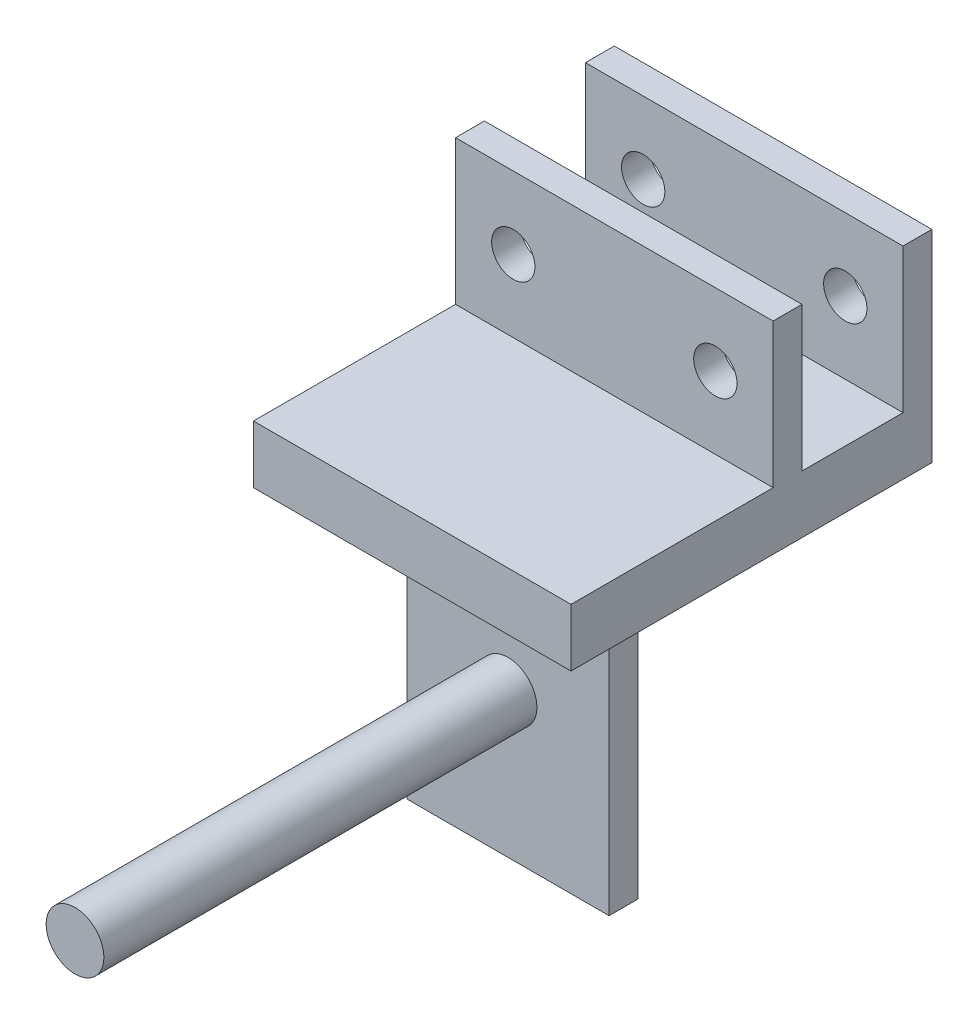
ISO-10303-21;
HEADER;
FILE_DESCRIPTION(('STEP AP214'),'2;1');
FILE_NAME('part.step','',(''),(''),'','','');
FILE_SCHEMA(('AUTOMOTIVE_DESIGN { 1 0 10303 214 1 1 1 1 }'));
ENDSEC;
DATA;
#1=APPLICATION_CONTEXT('core data for automotive mechanical design processes');
#2=APPLICATION_PROTOCOL_DEFINITION('international standard','automotive_design',2000,#1);
#3=PRODUCT_CONTEXT('',#1,'mechanical');
#4=PRODUCT('Part','Part','',(#3));
#5=PRODUCT_RELATED_PRODUCT_CATEGORY('part','',(#4));
#6=PRODUCT_DEFINITION_FORMATION('','',#4);
#7=PRODUCT_DEFINITION_CONTEXT('part definition',#1,'design');
#8=PRODUCT_DEFINITION('design','',#6,#7);
#9=PRODUCT_DEFINITION_SHAPE('','',#8);
#10=(LENGTH_UNIT() NAMED_UNIT(*) SI_UNIT(.MILLI.,.METRE.));
#11=(NAMED_UNIT(*) PLANE_ANGLE_UNIT() SI_UNIT($,.RADIAN.));
#12=(NAMED_UNIT(*) SI_UNIT($,.STERADIAN.) SOLID_ANGLE_UNIT());
#13=UNCERTAINTY_MEASURE_WITH_UNIT(LENGTH_MEASURE(1.E-05),#10,'distance_accuracy_value','');
#14=(GEOMETRIC_REPRESENTATION_CONTEXT(3) GLOBAL_UNCERTAINTY_ASSIGNED_CONTEXT((#13)) GLOBAL_UNIT_ASSIGNED_CONTEXT((#10,
#11,#12)) REPRESENTATION_CONTEXT('',''));
#15=CARTESIAN_POINT('',(0.,0.,0.));
#16=DIRECTION('',(0.,0.,1.));
#17=DIRECTION('',(1.,0.,0.));
#18=AXIS2_PLACEMENT_3D('',#15,#16,#17);
#19=CARTESIAN_POINT('',(0.,0.,0.));
#20=DIRECTION('',(0.,1.,0.));
#21=DIRECTION('',(0.,0.,1.));
#22=AXIS2_PLACEMENT_3D('',#19,#20,#21);
#23=PLANE('',#22);
#24=DIRECTION('',(0.,0.,1.));
#25=VECTOR('',#24,1.);
#26=CARTESIAN_POINT('',(-45.831985696917,0.,5.44161698032525));
#27=LINE('',#26,#25);
#28=CARTESIAN_POINT('',(-45.831985696917,0.,5.44161698032525));
#29=VERTEX_POINT('',#28);
#30=CARTESIAN_POINT('',(-45.831985696917,0.,30.4416169803253));
#31=VERTEX_POINT('',#30);
#32=EDGE_CURVE('E230',#29,#31,#27,.T.);
#33=ORIENTED_EDGE('',*,*,#32,.F.);
#34=DIRECTION('',(-1.,0.,0.));
#35=VECTOR('',#34,1.);
#36=CARTESIAN_POINT('',(-45.831985696917,0.,5.44161698032525));
#37=LINE('',#36,#35);
#38=CARTESIAN_POINT('',(-23.831985696917,0.,5.44161698032525));
#39=VERTEX_POINT('',#38);
#40=EDGE_CURVE('E246',#39,#29,#37,.T.);
#41=ORIENTED_EDGE('',*,*,#40,.F.);
#42=DIRECTION('',(0.,0.,-1.));
#43=VECTOR('',#42,1.);
#44=CARTESIAN_POINT('',(-23.831985696917,0.,5.44161698032525));
#45=LINE('',#44,#43);
#46=CARTESIAN_POINT('',(-23.831985696917,0.,30.4416169803253));
#47=VERTEX_POINT('',#46);
#48=EDGE_CURVE('E244',#47,#39,#45,.T.);
#49=ORIENTED_EDGE('',*,*,#48,.F.);
#50=DIRECTION('',(1.,0.,0.));
#51=VECTOR('',#50,1.);
#52=CARTESIAN_POINT('',(-45.831985696917,0.,30.4416169803253));
#53=LINE('',#52,#51);
#54=EDGE_CURVE('E242',#31,#47,#53,.T.);
#55=ORIENTED_EDGE('',*,*,#54,.F.);
#56=EDGE_LOOP('',(#33,#41,#49,#55));
#57=FACE_BOUND('',#56,.T.);
#58=DIRECTION('',(0.,0.,-1.));
#59=VECTOR('',#58,1.);
#60=CARTESIAN_POINT('',(-41.831985696917,0.,23.8053337188196));
#61=LINE('',#60,#59);
#62=CARTESIAN_POINT('',(-41.831985696917,0.,23.8053337188196));
#63=VERTEX_POINT('',#62);
#64=CARTESIAN_POINT('',(-41.831985696917,0.,21.8053337188196));
#65=VERTEX_POINT('',#64);
#66=EDGE_CURVE('E157',#63,#65,#61,.T.);
#67=ORIENTED_EDGE('',*,*,#66,.F.);
#68=DIRECTION('',(-1.,0.,0.));
#69=VECTOR('',#68,1.);
#70=CARTESIAN_POINT('',(-41.831985696917,0.,23.8053337188196));
#71=LINE('',#70,#69);
#72=CARTESIAN_POINT('',(-27.831985696917,0.,23.8053337188196));
#73=VERTEX_POINT('',#72);
#74=EDGE_CURVE('E154',#73,#63,#71,.T.);
#75=ORIENTED_EDGE('',*,*,#74,.F.);
#76=DIRECTION('',(0.,0.,1.));
#77=VECTOR('',#76,1.);
#78=CARTESIAN_POINT('',(-27.831985696917,0.,23.8053337188196));
#79=LINE('',#78,#77);
#80=CARTESIAN_POINT('',(-27.831985696917,0.,21.8053337188196));
#81=VERTEX_POINT('',#80);
#82=EDGE_CURVE('E56',#81,#73,#79,.T.);
#83=ORIENTED_EDGE('',*,*,#82,.F.);
#84=DIRECTION('',(1.,0.,0.));
#85=VECTOR('',#84,1.);
#86=CARTESIAN_POINT('',(-41.831985696917,0.,21.8053337188196));
#87=LINE('',#86,#85);
#88=EDGE_CURVE('E51',#65,#81,#87,.T.);
#89=ORIENTED_EDGE('',*,*,#88,.F.);
#90=EDGE_LOOP('',(#67,#75,#83,#89));
#91=FACE_BOUND('',#90,.T.);
#92=ADVANCED_FACE('F36',(#57,#91),#23,.F.);
#93=CARTESIAN_POINT('',(0.,4.,0.));
#94=DIRECTION('',(0.,1.,0.));
#95=DIRECTION('',(0.,0.,1.));
#96=AXIS2_PLACEMENT_3D('',#93,#94,#95);
#97=PLANE('',#96);
#98=DIRECTION('',(0.,0.,-1.));
#99=VECTOR('',#98,1.);
#100=CARTESIAN_POINT('',(-23.831985696917,4.,5.44161698032525));
#101=LINE('',#100,#99);
#102=CARTESIAN_POINT('',(-23.831985696917,4.,30.4416169803253));
#103=VERTEX_POINT('',#102);
#104=CARTESIAN_POINT('',(-23.831985696917,4.,16.4416169803253));
#105=VERTEX_POINT('',#104);
#106=EDGE_CURVE('E237',#103,#105,#101,.T.);
#107=ORIENTED_EDGE('',*,*,#106,.T.);
#108=DIRECTION('',(1.,0.,0.));
#109=VECTOR('',#108,1.);
#110=CARTESIAN_POINT('',(0.,4.,16.4416169803253));
#111=LINE('',#110,#109);
#112=CARTESIAN_POINT('',(-45.831985696917,4.,16.4416169803253));
#113=VERTEX_POINT('',#112);
#114=EDGE_CURVE('E183',#113,#105,#111,.T.);
#115=ORIENTED_EDGE('',*,*,#114,.F.);
#116=DIRECTION('',(0.,0.,1.));
#117=VECTOR('',#116,1.);
#118=CARTESIAN_POINT('',(-45.831985696917,4.,5.44161698032525));
#119=LINE('',#118,#117);
#120=CARTESIAN_POINT('',(-45.831985696917,4.,30.4416169803253));
#121=VERTEX_POINT('',#120);
#122=EDGE_CURVE('E234',#113,#121,#119,.T.);
#123=ORIENTED_EDGE('',*,*,#122,.T.);
#124=DIRECTION('',(1.,0.,0.));
#125=VECTOR('',#124,1.);
#126=CARTESIAN_POINT('',(-45.831985696917,4.,30.4416169803253));
#127=LINE('',#126,#125);
#128=EDGE_CURVE('E233',#121,#103,#127,.T.);
#129=ORIENTED_EDGE('',*,*,#128,.T.);
#130=EDGE_LOOP('',(#107,#115,#123,#129));
#131=FACE_BOUND('',#130,.T.);
#132=ADVANCED_FACE('F298',(#131),#97,.T.);
#133=CARTESIAN_POINT('',(-45.831985696917,4.,5.44161698032525));
#134=DIRECTION('',(1.,0.,0.));
#135=DIRECTION('',(0.,0.,-1.));
#136=AXIS2_PLACEMENT_3D('',#133,#134,#135);
#137=PLANE('',#136);
#138=ORIENTED_EDGE('',*,*,#32,.T.);
#139=DIRECTION('',(0.,-1.,0.));
#140=VECTOR('',#139,1.);
#141=CARTESIAN_POINT('',(-45.831985696917,4.,30.4416169803253));
#142=LINE('',#141,#140);
#143=EDGE_CURVE('E44',#121,#31,#142,.T.);
#144=ORIENTED_EDGE('',*,*,#143,.F.);
#145=ORIENTED_EDGE('',*,*,#122,.F.);
#146=DIRECTION('',(0.,-1.,0.));
#147=VECTOR('',#146,1.);
#148=CARTESIAN_POINT('',(-45.831985696917,14.,16.4416169803253));
#149=LINE('',#148,#147);
#150=CARTESIAN_POINT('',(-45.831985696917,14.,16.4416169803253));
#151=VERTEX_POINT('',#150);
#152=EDGE_CURVE('E207',#151,#113,#149,.T.);
#153=ORIENTED_EDGE('',*,*,#152,.F.);
#154=DIRECTION('',(0.,0.,1.));
#155=VECTOR('',#154,1.);
#156=CARTESIAN_POINT('',(-45.831985696917,14.,0.));
#157=LINE('',#156,#155);
#158=CARTESIAN_POINT('',(-45.831985696917,14.,14.4416169803253));
#159=VERTEX_POINT('',#158);
#160=EDGE_CURVE('E184',#159,#151,#157,.T.);
#161=ORIENTED_EDGE('',*,*,#160,.F.);
#162=DIRECTION('',(0.,-1.,0.));
#163=VECTOR('',#162,1.);
#164=CARTESIAN_POINT('',(-45.831985696917,14.,14.4416169803253));
#165=LINE('',#164,#163);
#166=CARTESIAN_POINT('',(-45.831985696917,4.,14.4416169803253));
#167=VERTEX_POINT('',#166);
#168=EDGE_CURVE('E195',#159,#167,#165,.T.);
#169=ORIENTED_EDGE('',*,*,#168,.T.);
#170=CARTESIAN_POINT('',(-45.831985696917,4.,7.44161698032525));
#171=VERTEX_POINT('',#170);
#172=EDGE_CURVE('E231',#171,#167,#119,.T.);
#173=ORIENTED_EDGE('',*,*,#172,.F.);
#174=DIRECTION('',(0.,-1.,0.));
#175=VECTOR('',#174,1.);
#176=CARTESIAN_POINT('',(-45.831985696917,14.,7.44161698032525));
#177=LINE('',#176,#175);
#178=CARTESIAN_POINT('',(-45.831985696917,14.,7.44161698032525));
#179=VERTEX_POINT('',#178);
#180=EDGE_CURVE('E227',#179,#171,#177,.T.);
#181=ORIENTED_EDGE('',*,*,#180,.F.);
#182=DIRECTION('',(0.,0.,1.));
#183=VECTOR('',#182,1.);
#184=CARTESIAN_POINT('',(-45.831985696917,14.,0.));
#185=LINE('',#184,#183);
#186=CARTESIAN_POINT('',(-45.831985696917,14.,5.44161698032525));
#187=VERTEX_POINT('',#186);
#188=EDGE_CURVE('E211',#187,#179,#185,.T.);
#189=ORIENTED_EDGE('',*,*,#188,.F.);
#190=DIRECTION('',(0.,-1.,0.));
#191=VECTOR('',#190,1.);
#192=CARTESIAN_POINT('',(-45.831985696917,4.,5.44161698032525));
#193=LINE('',#192,#191);
#194=EDGE_CURVE('E239',#187,#29,#193,.T.);
#195=ORIENTED_EDGE('',*,*,#194,.T.);
#196=EDGE_LOOP('',(#138,#144,#145,#153,#161,#169,#173,#181,#189,#195));
#197=FACE_BOUND('',#196,.T.);
#198=ADVANCED_FACE('F38',(#197),#137,.F.);
#199=CARTESIAN_POINT('',(-45.831985696917,4.,30.4416169803253));
#200=DIRECTION('',(0.,0.,-1.));
#201=DIRECTION('',(-1.,0.,0.));
#202=AXIS2_PLACEMENT_3D('',#199,#200,#201);
#203=PLANE('',#202);
#204=ORIENTED_EDGE('',*,*,#54,.T.);
#205=DIRECTION('',(0.,-1.,0.));
#206=VECTOR('',#205,1.);
#207=CARTESIAN_POINT('',(-23.831985696917,4.,30.4416169803253));
#208=LINE('',#207,#206);
#209=EDGE_CURVE('E253',#103,#47,#208,.T.);
#210=ORIENTED_EDGE('',*,*,#209,.F.);
#211=ORIENTED_EDGE('',*,*,#128,.F.);
#212=ORIENTED_EDGE('',*,*,#143,.T.);
#213=EDGE_LOOP('',(#204,#210,#211,#212));
#214=FACE_BOUND('',#213,.T.);
#215=ADVANCED_FACE('F303',(#214),#203,.F.);
#216=CARTESIAN_POINT('',(-23.831985696917,4.,5.44161698032525));
#217=DIRECTION('',(-1.,0.,0.));
#218=DIRECTION('',(0.,0.,1.));
#219=AXIS2_PLACEMENT_3D('',#216,#217,#218);
#220=PLANE('',#219);
#221=ORIENTED_EDGE('',*,*,#48,.T.);
#222=DIRECTION('',(0.,-1.,0.));
#223=VECTOR('',#222,1.);
#224=CARTESIAN_POINT('',(-23.831985696917,4.,5.44161698032525));
#225=LINE('',#224,#223);
#226=CARTESIAN_POINT('',(-23.831985696917,14.,5.44161698032525));
#227=VERTEX_POINT('',#226);
#228=EDGE_CURVE('E250',#227,#39,#225,.T.);
#229=ORIENTED_EDGE('',*,*,#228,.F.);
#230=DIRECTION('',(0.,0.,-1.));
#231=VECTOR('',#230,1.);
#232=CARTESIAN_POINT('',(-23.831985696917,14.,0.));
#233=LINE('',#232,#231);
#234=CARTESIAN_POINT('',(-23.831985696917,14.,7.44161698032525));
#235=VERTEX_POINT('',#234);
#236=EDGE_CURVE('E216',#235,#227,#233,.T.);
#237=ORIENTED_EDGE('',*,*,#236,.F.);
#238=DIRECTION('',(0.,-1.,0.));
#239=VECTOR('',#238,1.);
#240=CARTESIAN_POINT('',(-23.831985696917,14.,7.44161698032525));
#241=LINE('',#240,#239);
#242=CARTESIAN_POINT('',(-23.831985696917,4.,7.44161698032525));
#243=VERTEX_POINT('',#242);
#244=EDGE_CURVE('E222',#235,#243,#241,.T.);
#245=ORIENTED_EDGE('',*,*,#244,.T.);
#246=CARTESIAN_POINT('',(-23.831985696917,4.,14.4416169803253));
#247=VERTEX_POINT('',#246);
#248=EDGE_CURVE('E236',#247,#243,#101,.T.);
#249=ORIENTED_EDGE('',*,*,#248,.F.);
#250=DIRECTION('',(0.,-1.,0.));
#251=VECTOR('',#250,1.);
#252=CARTESIAN_POINT('',(-23.831985696917,14.,14.4416169803253));
#253=LINE('',#252,#251);
#254=CARTESIAN_POINT('',(-23.831985696917,14.,14.4416169803253));
#255=VERTEX_POINT('',#254);
#256=EDGE_CURVE('E201',#255,#247,#253,.T.);
#257=ORIENTED_EDGE('',*,*,#256,.F.);
#258=DIRECTION('',(0.,0.,-1.));
#259=VECTOR('',#258,1.);
#260=CARTESIAN_POINT('',(-23.831985696917,14.,0.));
#261=LINE('',#260,#259);
#262=CARTESIAN_POINT('',(-23.831985696917,14.,16.4416169803253));
#263=VERTEX_POINT('',#262);
#264=EDGE_CURVE('E190',#263,#255,#261,.T.);
#265=ORIENTED_EDGE('',*,*,#264,.F.);
#266=DIRECTION('',(0.,-1.,0.));
#267=VECTOR('',#266,1.);
#268=CARTESIAN_POINT('',(-23.831985696917,14.,16.4416169803253));
#269=LINE('',#268,#267);
#270=EDGE_CURVE('E204',#263,#105,#269,.T.);
#271=ORIENTED_EDGE('',*,*,#270,.T.);
#272=ORIENTED_EDGE('',*,*,#106,.F.);
#273=ORIENTED_EDGE('',*,*,#209,.T.);
#274=EDGE_LOOP('',(#221,#229,#237,#245,#249,#257,#265,#271,#272,#273));
#275=FACE_BOUND('',#274,.T.);
#276=ADVANCED_FACE('F281',(#275),#220,.F.);
#277=CARTESIAN_POINT('',(-45.831985696917,4.,5.44161698032525));
#278=DIRECTION('',(0.,0.,1.));
#279=DIRECTION('',(1.,0.,0.));
#280=AXIS2_PLACEMENT_3D('',#277,#278,#279);
#281=PLANE('',#280);
#282=CARTESIAN_POINT('',(-27.831985696917,9.,5.44161698032526));
#283=DIRECTION('',(0.,0.,1.));
#284=DIRECTION('',(1.,0.,0.));
#285=AXIS2_PLACEMENT_3D('',#282,#283,#284);
#286=CIRCLE('',#285,1.5);
#287=CARTESIAN_POINT('',(-26.331985696917,9.,5.44161698032526));
#288=VERTEX_POINT('',#287);
#289=EDGE_CURVE('E161',#288,#288,#286,.T.);
#290=ORIENTED_EDGE('',*,*,#289,.T.);
#291=EDGE_LOOP('',(#290));
#292=FACE_BOUND('',#291,.T.);
#293=CARTESIAN_POINT('',(-41.831985696917,9.,5.44161698032526));
#294=DIRECTION('',(0.,0.,1.));
#295=DIRECTION('',(1.,0.,0.));
#296=AXIS2_PLACEMENT_3D('',#293,#294,#295);
#297=CIRCLE('',#296,1.5);
#298=CARTESIAN_POINT('',(-40.331985696917,9.,5.44161698032526));
#299=VERTEX_POINT('',#298);
#300=EDGE_CURVE('E174',#299,#299,#297,.T.);
#301=ORIENTED_EDGE('',*,*,#300,.T.);
#302=EDGE_LOOP('',(#301));
#303=FACE_BOUND('',#302,.T.);
#304=ORIENTED_EDGE('',*,*,#40,.T.);
#305=ORIENTED_EDGE('',*,*,#194,.F.);
#306=DIRECTION('',(-1.,0.,0.));
#307=VECTOR('',#306,1.);
#308=CARTESIAN_POINT('',(0.,14.,5.44161698032525));
#309=LINE('',#308,#307);
#310=EDGE_CURVE('E219',#227,#187,#309,.T.);
#311=ORIENTED_EDGE('',*,*,#310,.F.);
#312=ORIENTED_EDGE('',*,*,#228,.T.);
#313=EDGE_LOOP('',(#304,#305,#311,#312));
#314=FACE_BOUND('',#313,.T.);
#315=ADVANCED_FACE('F309',(#292,#303,#314),#281,.F.);
#316=DIRECTION('',(1.,0.,0.));
#317=VECTOR('',#316,1.);
#318=CARTESIAN_POINT('',(0.,4.,14.4416169803253));
#319=LINE('',#318,#317);
#320=EDGE_CURVE('E188',#167,#247,#319,.T.);
#321=ORIENTED_EDGE('',*,*,#320,.T.);
#322=ORIENTED_EDGE('',*,*,#248,.T.);
#323=DIRECTION('',(1.,0.,0.));
#324=VECTOR('',#323,1.);
#325=CARTESIAN_POINT('',(0.,4.,7.44161698032526));
#326=LINE('',#325,#324);
#327=EDGE_CURVE('E210',#171,#243,#326,.T.);
#328=ORIENTED_EDGE('',*,*,#327,.F.);
#329=ORIENTED_EDGE('',*,*,#172,.T.);
#330=EDGE_LOOP('',(#321,#322,#328,#329));
#331=FACE_BOUND('',#330,.T.);
#332=ADVANCED_FACE('F278',(#331),#97,.T.);
#333=CARTESIAN_POINT('',(0.,14.,7.44161698032526));
#334=DIRECTION('',(0.,0.,-1.));
#335=DIRECTION('',(-1.,0.,0.));
#336=AXIS2_PLACEMENT_3D('',#333,#334,#335);
#337=PLANE('',#336);
#338=CARTESIAN_POINT('',(-27.831985696917,9.,7.44161698032526));
#339=DIRECTION('',(0.,0.,-1.));
#340=DIRECTION('',(-1.,0.,0.));
#341=AXIS2_PLACEMENT_3D('',#338,#339,#340);
#342=CIRCLE('',#341,1.5);
#343=CARTESIAN_POINT('',(-29.331985696917,9.,7.44161698032526));
#344=VERTEX_POINT('',#343);
#345=EDGE_CURVE('E170',#344,#344,#342,.T.);
#346=ORIENTED_EDGE('',*,*,#345,.T.);
#347=EDGE_LOOP('',(#346));
#348=FACE_BOUND('',#347,.T.);
#349=CARTESIAN_POINT('',(-41.831985696917,9.,7.44161698032525));
#350=DIRECTION('',(0.,0.,-1.));
#351=DIRECTION('',(-1.,0.,0.));
#352=AXIS2_PLACEMENT_3D('',#349,#350,#351);
#353=CIRCLE('',#352,1.5);
#354=CARTESIAN_POINT('',(-43.331985696917,9.,7.44161698032525));
#355=VERTEX_POINT('',#354);
#356=EDGE_CURVE('E180',#355,#355,#353,.T.);
#357=ORIENTED_EDGE('',*,*,#356,.T.);
#358=EDGE_LOOP('',(#357));
#359=FACE_BOUND('',#358,.T.);
#360=ORIENTED_EDGE('',*,*,#327,.T.);
#361=ORIENTED_EDGE('',*,*,#244,.F.);
#362=DIRECTION('',(1.,0.,0.));
#363=VECTOR('',#362,1.);
#364=CARTESIAN_POINT('',(0.,14.,7.44161698032526));
#365=LINE('',#364,#363);
#366=EDGE_CURVE('E214',#179,#235,#365,.T.);
#367=ORIENTED_EDGE('',*,*,#366,.F.);
#368=ORIENTED_EDGE('',*,*,#180,.T.);
#369=EDGE_LOOP('',(#360,#361,#367,#368));
#370=FACE_BOUND('',#369,.T.);
#371=ADVANCED_FACE('F286',(#348,#359,#370),#337,.F.);
#372=CARTESIAN_POINT('',(0.,14.,0.));
#373=DIRECTION('',(0.,1.,0.));
#374=DIRECTION('',(0.,0.,1.));
#375=AXIS2_PLACEMENT_3D('',#372,#373,#374);
#376=PLANE('',#375);
#377=ORIENTED_EDGE('',*,*,#188,.T.);
#378=ORIENTED_EDGE('',*,*,#366,.T.);
#379=ORIENTED_EDGE('',*,*,#236,.T.);
#380=ORIENTED_EDGE('',*,*,#310,.T.);
#381=EDGE_LOOP('',(#377,#378,#379,#380));
#382=FACE_BOUND('',#381,.T.);
#383=ADVANCED_FACE('F312',(#382),#376,.T.);
#384=CARTESIAN_POINT('',(0.,14.,16.4416169803253));
#385=DIRECTION('',(0.,0.,-1.));
#386=DIRECTION('',(-1.,0.,0.));
#387=AXIS2_PLACEMENT_3D('',#384,#385,#386);
#388=PLANE('',#387);
#389=CARTESIAN_POINT('',(-27.831985696917,9.,16.4416169803253));
#390=DIRECTION('',(0.,0.,1.));
#391=DIRECTION('',(1.,0.,0.));
#392=AXIS2_PLACEMENT_3D('',#389,#390,#391);
#393=CIRCLE('',#392,1.5);
#394=CARTESIAN_POINT('',(-26.331985696917,9.,16.4416169803253));
#395=VERTEX_POINT('',#394);
#396=EDGE_CURVE('E158',#395,#395,#393,.T.);
#397=ORIENTED_EDGE('',*,*,#396,.F.);
#398=EDGE_LOOP('',(#397));
#399=FACE_BOUND('',#398,.T.);
#400=CARTESIAN_POINT('',(-41.831985696917,9.,16.4416169803253));
#401=DIRECTION('',(0.,0.,1.));
#402=DIRECTION('',(1.,0.,0.));
#403=AXIS2_PLACEMENT_3D('',#400,#401,#402);
#404=CIRCLE('',#403,1.5);
#405=CARTESIAN_POINT('',(-40.331985696917,9.,16.4416169803253));
#406=VERTEX_POINT('',#405);
#407=EDGE_CURVE('E173',#406,#406,#404,.T.);
#408=ORIENTED_EDGE('',*,*,#407,.F.);
#409=EDGE_LOOP('',(#408));
#410=FACE_BOUND('',#409,.T.);
#411=ORIENTED_EDGE('',*,*,#114,.T.);
#412=ORIENTED_EDGE('',*,*,#270,.F.);
#413=DIRECTION('',(1.,0.,0.));
#414=VECTOR('',#413,1.);
#415=CARTESIAN_POINT('',(0.,14.,16.4416169803253));
#416=LINE('',#415,#414);
#417=EDGE_CURVE('E187',#151,#263,#416,.T.);
#418=ORIENTED_EDGE('',*,*,#417,.F.);
#419=ORIENTED_EDGE('',*,*,#152,.T.);
#420=EDGE_LOOP('',(#411,#412,#418,#419));
#421=FACE_BOUND('',#420,.T.);
#422=ADVANCED_FACE('F269',(#399,#410,#421),#388,.F.);
#423=CARTESIAN_POINT('',(0.,14.,14.4416169803253));
#424=DIRECTION('',(0.,0.,-1.));
#425=DIRECTION('',(-1.,0.,0.));
#426=AXIS2_PLACEMENT_3D('',#423,#424,#425);
#427=PLANE('',#426);
#428=CARTESIAN_POINT('',(-27.831985696917,9.,14.4416169803253));
#429=DIRECTION('',(0.,0.,-1.));
#430=DIRECTION('',(-1.,0.,0.));
#431=AXIS2_PLACEMENT_3D('',#428,#429,#430);
#432=CIRCLE('',#431,1.5);
#433=CARTESIAN_POINT('',(-29.331985696917,9.,14.4416169803253));
#434=VERTEX_POINT('',#433);
#435=EDGE_CURVE('E168',#434,#434,#432,.T.);
#436=ORIENTED_EDGE('',*,*,#435,.F.);
#437=EDGE_LOOP('',(#436));
#438=FACE_BOUND('',#437,.T.);
#439=CARTESIAN_POINT('',(-41.831985696917,9.,14.4416169803253));
#440=DIRECTION('',(0.,0.,-1.));
#441=DIRECTION('',(-1.,0.,0.));
#442=AXIS2_PLACEMENT_3D('',#439,#440,#441);
#443=CIRCLE('',#442,1.5);
#444=CARTESIAN_POINT('',(-43.331985696917,9.,14.4416169803253));
#445=VERTEX_POINT('',#444);
#446=EDGE_CURVE('E177',#445,#445,#443,.T.);
#447=ORIENTED_EDGE('',*,*,#446,.F.);
#448=EDGE_LOOP('',(#447));
#449=FACE_BOUND('',#448,.T.);
#450=ORIENTED_EDGE('',*,*,#320,.F.);
#451=ORIENTED_EDGE('',*,*,#168,.F.);
#452=DIRECTION('',(1.,0.,0.));
#453=VECTOR('',#452,1.);
#454=CARTESIAN_POINT('',(0.,14.,14.4416169803253));
#455=LINE('',#454,#453);
#456=EDGE_CURVE('E192',#159,#255,#455,.T.);
#457=ORIENTED_EDGE('',*,*,#456,.T.);
#458=ORIENTED_EDGE('',*,*,#256,.T.);
#459=EDGE_LOOP('',(#450,#451,#457,#458));
#460=FACE_BOUND('',#459,.T.);
#461=ADVANCED_FACE('F265',(#438,#449,#460),#427,.T.);
#462=CARTESIAN_POINT('',(0.,14.,0.));
#463=DIRECTION('',(0.,1.,0.));
#464=DIRECTION('',(0.,0.,1.));
#465=AXIS2_PLACEMENT_3D('',#462,#463,#464);
#466=PLANE('',#465);
#467=ORIENTED_EDGE('',*,*,#160,.T.);
#468=ORIENTED_EDGE('',*,*,#417,.T.);
#469=ORIENTED_EDGE('',*,*,#264,.T.);
#470=ORIENTED_EDGE('',*,*,#456,.F.);
#471=EDGE_LOOP('',(#467,#468,#469,#470));
#472=FACE_BOUND('',#471,.T.);
#473=ADVANCED_FACE('F268',(#472),#466,.T.);
#474=CARTESIAN_POINT('',(-41.831985696917,9.,5.44161698032526));
#475=DIRECTION('',(0.,0.,1.));
#476=DIRECTION('',(1.,0.,0.));
#477=AXIS2_PLACEMENT_3D('',#474,#475,#476);
#478=CYLINDRICAL_SURFACE('',#477,1.5);
#479=ORIENTED_EDGE('',*,*,#446,.T.);
#480=EDGE_LOOP('',(#479));
#481=FACE_BOUND('',#480,.T.);
#482=ORIENTED_EDGE('',*,*,#407,.T.);
#483=EDGE_LOOP('',(#482));
#484=FACE_BOUND('',#483,.T.);
#485=ADVANCED_FACE('F391',(#481,#484),#478,.F.);
#486=ORIENTED_EDGE('',*,*,#300,.F.);
#487=EDGE_LOOP('',(#486));
#488=FACE_BOUND('',#487,.T.);
#489=ORIENTED_EDGE('',*,*,#356,.F.);
#490=EDGE_LOOP('',(#489));
#491=FACE_BOUND('',#490,.T.);
#492=ADVANCED_FACE('F421',(#488,#491),#478,.F.);
#493=CARTESIAN_POINT('',(-27.831985696917,9.,5.44161698032526));
#494=DIRECTION('',(0.,0.,1.));
#495=DIRECTION('',(1.,0.,0.));
#496=AXIS2_PLACEMENT_3D('',#493,#494,#495);
#497=CYLINDRICAL_SURFACE('',#496,1.5);
#498=ORIENTED_EDGE('',*,*,#435,.T.);
#499=EDGE_LOOP('',(#498));
#500=FACE_BOUND('',#499,.T.);
#501=ORIENTED_EDGE('',*,*,#396,.T.);
#502=EDGE_LOOP('',(#501));
#503=FACE_BOUND('',#502,.T.);
#504=ADVANCED_FACE('F262',(#500,#503),#497,.F.);
#505=ORIENTED_EDGE('',*,*,#289,.F.);
#506=EDGE_LOOP('',(#505));
#507=FACE_BOUND('',#506,.T.);
#508=ORIENTED_EDGE('',*,*,#345,.F.);
#509=EDGE_LOOP('',(#508));
#510=FACE_BOUND('',#509,.T.);
#511=ADVANCED_FACE('F439',(#507,#510),#497,.F.);
#512=CARTESIAN_POINT('',(-41.831985696917,-20.,23.8053337188196));
#513=DIRECTION('',(1.,0.,0.));
#514=DIRECTION('',(0.,0.,-1.));
#515=AXIS2_PLACEMENT_3D('',#512,#513,#514);
#516=PLANE('',#515);
#517=ORIENTED_EDGE('',*,*,#66,.T.);
#518=DIRECTION('',(0.,1.,0.));
#519=VECTOR('',#518,1.);
#520=CARTESIAN_POINT('',(-41.831985696917,-20.,21.8053337188196));
#521=LINE('',#520,#519);
#522=CARTESIAN_POINT('',(-41.831985696917,-20.,21.8053337188196));
#523=VERTEX_POINT('',#522);
#524=EDGE_CURVE('E138',#523,#65,#521,.T.);
#525=ORIENTED_EDGE('',*,*,#524,.F.);
#526=DIRECTION('',(0.,0.,-1.));
#527=VECTOR('',#526,1.);
#528=CARTESIAN_POINT('',(-41.831985696917,-20.,23.8053337188196));
#529=LINE('',#528,#527);
#530=CARTESIAN_POINT('',(-41.831985696917,-20.,23.8053337188196));
#531=VERTEX_POINT('',#530);
#532=EDGE_CURVE('E145',#531,#523,#529,.T.);
#533=ORIENTED_EDGE('',*,*,#532,.F.);
#534=DIRECTION('',(0.,1.,0.));
#535=VECTOR('',#534,1.);
#536=CARTESIAN_POINT('',(-41.831985696917,-20.,23.8053337188196));
#537=LINE('',#536,#535);
#538=EDGE_CURVE('E526',#531,#63,#537,.T.);
#539=ORIENTED_EDGE('',*,*,#538,.T.);
#540=EDGE_LOOP('',(#517,#525,#533,#539));
#541=FACE_BOUND('',#540,.T.);
#542=ADVANCED_FACE('F156',(#541),#516,.F.);
#543=CARTESIAN_POINT('',(-41.831985696917,-20.,21.8053337188196));
#544=DIRECTION('',(0.,0.,1.));
#545=DIRECTION('',(1.,0.,0.));
#546=AXIS2_PLACEMENT_3D('',#543,#544,#545);
#547=PLANE('',#546);
#548=ORIENTED_EDGE('',*,*,#88,.T.);
#549=DIRECTION('',(0.,1.,0.));
#550=VECTOR('',#549,1.);
#551=CARTESIAN_POINT('',(-27.831985696917,-20.,21.8053337188196));
#552=LINE('',#551,#550);
#553=CARTESIAN_POINT('',(-27.831985696917,-20.,21.8053337188196));
#554=VERTEX_POINT('',#553);
#555=EDGE_CURVE('E141',#554,#81,#552,.T.);
#556=ORIENTED_EDGE('',*,*,#555,.F.);
#557=DIRECTION('',(1.,0.,0.));
#558=VECTOR('',#557,1.);
#559=CARTESIAN_POINT('',(-41.831985696917,-20.,21.8053337188196));
#560=LINE('',#559,#558);
#561=EDGE_CURVE('E134',#523,#554,#560,.T.);
#562=ORIENTED_EDGE('',*,*,#561,.F.);
#563=ORIENTED_EDGE('',*,*,#524,.T.);
#564=EDGE_LOOP('',(#548,#556,#562,#563));
#565=FACE_BOUND('',#564,.T.);
#566=ADVANCED_FACE('F136',(#565),#547,.F.);
#567=CARTESIAN_POINT('',(-27.831985696917,-20.,23.8053337188196));
#568=DIRECTION('',(-1.,0.,0.));
#569=DIRECTION('',(0.,0.,1.));
#570=AXIS2_PLACEMENT_3D('',#567,#568,#569);
#571=PLANE('',#570);
#572=ORIENTED_EDGE('',*,*,#82,.T.);
#573=DIRECTION('',(0.,1.,0.));
#574=VECTOR('',#573,1.);
#575=CARTESIAN_POINT('',(-27.831985696917,-20.,23.8053337188196));
#576=LINE('',#575,#574);
#577=CARTESIAN_POINT('',(-27.831985696917,-20.,23.8053337188196));
#578=VERTEX_POINT('',#577);
#579=EDGE_CURVE('E163',#578,#73,#576,.T.);
#580=ORIENTED_EDGE('',*,*,#579,.F.);
#581=DIRECTION('',(0.,0.,1.));
#582=VECTOR('',#581,1.);
#583=CARTESIAN_POINT('',(-27.831985696917,-20.,23.8053337188196));
#584=LINE('',#583,#582);
#585=EDGE_CURVE('E144',#554,#578,#584,.T.);
#586=ORIENTED_EDGE('',*,*,#585,.F.);
#587=ORIENTED_EDGE('',*,*,#555,.T.);
#588=EDGE_LOOP('',(#572,#580,#586,#587));
#589=FACE_BOUND('',#588,.T.);
#590=ADVANCED_FACE('F468',(#589),#571,.F.);
#591=CARTESIAN_POINT('',(-41.831985696917,-20.,23.8053337188196));
#592=DIRECTION('',(0.,0.,-1.));
#593=DIRECTION('',(-1.,0.,0.));
#594=AXIS2_PLACEMENT_3D('',#591,#592,#593);
#595=PLANE('',#594);
#596=CARTESIAN_POINT('',(-34.831985696917,-10.,23.8053337188196));
#597=DIRECTION('',(0.,0.,-1.));
#598=DIRECTION('',(-1.,0.,0.));
#599=AXIS2_PLACEMENT_3D('',#596,#597,#598);
#600=CIRCLE('',#599,2.);
#601=CARTESIAN_POINT('',(-36.831985696917,-10.,23.8053337188196));
#602=VERTEX_POINT('',#601);
#603=EDGE_CURVE('E11',#602,#602,#600,.F.);
#604=ORIENTED_EDGE('',*,*,#603,.F.);
#605=EDGE_LOOP('',(#604));
#606=FACE_BOUND('',#605,.T.);
#607=ORIENTED_EDGE('',*,*,#74,.T.);
#608=ORIENTED_EDGE('',*,*,#538,.F.);
#609=DIRECTION('',(-1.,0.,0.));
#610=VECTOR('',#609,1.);
#611=CARTESIAN_POINT('',(-41.831985696917,-20.,23.8053337188196));
#612=LINE('',#611,#610);
#613=EDGE_CURVE('E150',#578,#531,#612,.T.);
#614=ORIENTED_EDGE('',*,*,#613,.F.);
#615=ORIENTED_EDGE('',*,*,#579,.T.);
#616=EDGE_LOOP('',(#607,#608,#614,#615));
#617=FACE_BOUND('',#616,.T.);
#618=ADVANCED_FACE('F477',(#606,#617),#595,.F.);
#619=CARTESIAN_POINT('',(0.,-20.,0.));
#620=DIRECTION('',(0.,-1.,0.));
#621=DIRECTION('',(0.,0.,-1.));
#622=AXIS2_PLACEMENT_3D('',#619,#620,#621);
#623=PLANE('',#622);
#624=ORIENTED_EDGE('',*,*,#532,.T.);
#625=ORIENTED_EDGE('',*,*,#561,.T.);
#626=ORIENTED_EDGE('',*,*,#585,.T.);
#627=ORIENTED_EDGE('',*,*,#613,.T.);
#628=EDGE_LOOP('',(#624,#625,#626,#627));
#629=FACE_BOUND('',#628,.T.);
#630=ADVANCED_FACE('F148',(#629),#623,.T.);
#631=CARTESIAN_POINT('',(-34.831985696917,-10.,53.8053337188196));
#632=DIRECTION('',(0.,0.,-1.));
#633=DIRECTION('',(-1.,0.,0.));
#634=AXIS2_PLACEMENT_3D('',#631,#632,#633);
#635=CYLINDRICAL_SURFACE('',#634,2.);
#636=CARTESIAN_POINT('',(-34.831985696917,-10.,53.8053337188196));
#637=DIRECTION('',(0.,0.,1.));
#638=DIRECTION('',(1.,0.,0.));
#639=AXIS2_PLACEMENT_3D('',#636,#637,#638);
#640=CIRCLE('',#639,2.);
#641=CARTESIAN_POINT('',(-32.831985696917,-10.,53.8053337188196));
#642=VERTEX_POINT('',#641);
#643=EDGE_CURVE('E521',#642,#642,#640,.T.);
#644=ORIENTED_EDGE('',*,*,#643,.F.);
#645=EDGE_LOOP('',(#644));
#646=FACE_BOUND('',#645,.T.);
#647=ORIENTED_EDGE('',*,*,#603,.T.);
#648=EDGE_LOOP('',(#647));
#649=FACE_BOUND('',#648,.T.);
#650=ADVANCED_FACE('F489',(#646,#649),#635,.T.);
#651=CARTESIAN_POINT('',(-34.831985696917,-10.,53.8053337188196));
#652=DIRECTION('',(0.,0.,1.));
#653=DIRECTION('',(1.,0.,0.));
#654=AXIS2_PLACEMENT_3D('',#651,#652,#653);
#655=PLANE('',#654);
#656=ORIENTED_EDGE('',*,*,#643,.T.);
#657=EDGE_LOOP('',(#656));
#658=FACE_BOUND('',#657,.T.);
#659=ADVANCED_FACE('F505',(#658),#655,.T.);
#660=CLOSED_SHELL('',(#92,#132,#198,#215,#276,#315,#332,#371,#383,#422,#461,#473,#485,#492,#504,
#511,#542,#566,#590,#618,#630,#650,#659));
#661=MANIFOLD_SOLID_BREP('B2',#660);
#662=ADVANCED_BREP_SHAPE_REPRESENTATION('',(#18,#661),#14);
#663=SHAPE_DEFINITION_REPRESENTATION(#9,#662);
ENDSEC;
END-ISO-10303-21;
